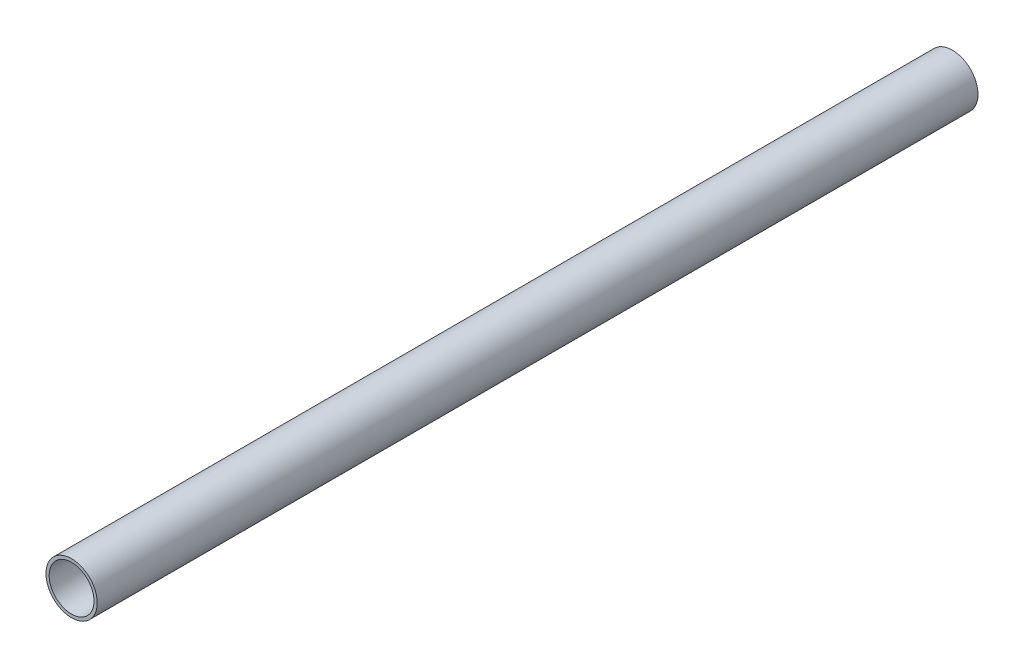
ISO-10303-21;
HEADER;
FILE_DESCRIPTION(('STEP AP214'),'2;1');
FILE_NAME('part.step','',(''),(''),'','','');
FILE_SCHEMA(('AUTOMOTIVE_DESIGN { 1 0 10303 214 1 1 1 1 }'));
ENDSEC;
DATA;
#1=APPLICATION_CONTEXT('core data for automotive mechanical design processes');
#2=APPLICATION_PROTOCOL_DEFINITION('international standard','automotive_design',2000,#1);
#3=PRODUCT_CONTEXT('',#1,'mechanical');
#4=PRODUCT('Part','Part','',(#3));
#5=PRODUCT_RELATED_PRODUCT_CATEGORY('part','',(#4));
#6=PRODUCT_DEFINITION_FORMATION('','',#4);
#7=PRODUCT_DEFINITION_CONTEXT('part definition',#1,'design');
#8=PRODUCT_DEFINITION('design','',#6,#7);
#9=PRODUCT_DEFINITION_SHAPE('','',#8);
#10=(LENGTH_UNIT() NAMED_UNIT(*) SI_UNIT(.MILLI.,.METRE.));
#11=(NAMED_UNIT(*) PLANE_ANGLE_UNIT() SI_UNIT($,.RADIAN.));
#12=(NAMED_UNIT(*) SI_UNIT($,.STERADIAN.) SOLID_ANGLE_UNIT());
#13=UNCERTAINTY_MEASURE_WITH_UNIT(LENGTH_MEASURE(1.E-05),#10,'distance_accuracy_value','');
#14=(GEOMETRIC_REPRESENTATION_CONTEXT(3) GLOBAL_UNCERTAINTY_ASSIGNED_CONTEXT((#13)) GLOBAL_UNIT_ASSIGNED_CONTEXT((#10,
#11,#12)) REPRESENTATION_CONTEXT('',''));
#15=CARTESIAN_POINT('',(0.,0.,0.));
#16=DIRECTION('',(0.,0.,1.));
#17=DIRECTION('',(1.,0.,0.));
#18=AXIS2_PLACEMENT_3D('',#15,#16,#17);
#19=CARTESIAN_POINT('',(0.,0.,275.));
#20=DIRECTION('',(0.,0.,1.));
#21=DIRECTION('',(1.,0.,0.));
#22=AXIS2_PLACEMENT_3D('',#19,#20,#21);
#23=PLANE('',#22);
#24=CARTESIAN_POINT('',(0.,0.,275.));
#25=DIRECTION('',(0.,0.,1.));
#26=DIRECTION('',(1.,0.,0.));
#27=AXIS2_PLACEMENT_3D('',#24,#25,#26);
#28=CIRCLE('',#27,7.);
#29=CARTESIAN_POINT('',(7.,0.,275.));
#30=VERTEX_POINT('',#29);
#31=EDGE_CURVE('E48',#30,#30,#28,.T.);
#32=ORIENTED_EDGE('',*,*,#31,.F.);
#33=EDGE_LOOP('',(#32));
#34=FACE_BOUND('',#33,.T.);
#35=CARTESIAN_POINT('',(0.,0.,275.));
#36=DIRECTION('',(0.,0.,1.));
#37=DIRECTION('',(1.,0.,0.));
#38=AXIS2_PLACEMENT_3D('',#35,#36,#37);
#39=CIRCLE('',#38,8.);
#40=CARTESIAN_POINT('',(8.,0.,275.));
#41=VERTEX_POINT('',#40);
#42=EDGE_CURVE('E11',#41,#41,#39,.T.);
#43=ORIENTED_EDGE('',*,*,#42,.T.);
#44=EDGE_LOOP('',(#43));
#45=FACE_BOUND('',#44,.T.);
#46=ADVANCED_FACE('F34',(#34,#45),#23,.T.);
#47=CARTESIAN_POINT('',(0.,0.,0.));
#48=DIRECTION('',(0.,0.,1.));
#49=DIRECTION('',(1.,0.,0.));
#50=AXIS2_PLACEMENT_3D('',#47,#48,#49);
#51=PLANE('',#50);
#52=CARTESIAN_POINT('',(0.,0.,0.));
#53=DIRECTION('',(0.,0.,1.));
#54=DIRECTION('',(1.,0.,0.));
#55=AXIS2_PLACEMENT_3D('',#52,#53,#54);
#56=CIRCLE('',#55,7.);
#57=CARTESIAN_POINT('',(7.,0.,0.));
#58=VERTEX_POINT('',#57);
#59=EDGE_CURVE('E38',#58,#58,#56,.T.);
#60=ORIENTED_EDGE('',*,*,#59,.T.);
#61=EDGE_LOOP('',(#60));
#62=FACE_BOUND('',#61,.T.);
#63=CARTESIAN_POINT('',(0.,0.,0.));
#64=DIRECTION('',(0.,0.,1.));
#65=DIRECTION('',(1.,0.,0.));
#66=AXIS2_PLACEMENT_3D('',#63,#64,#65);
#67=CIRCLE('',#66,8.);
#68=CARTESIAN_POINT('',(8.,0.,0.));
#69=VERTEX_POINT('',#68);
#70=EDGE_CURVE('E42',#69,#69,#67,.T.);
#71=ORIENTED_EDGE('',*,*,#70,.F.);
#72=EDGE_LOOP('',(#71));
#73=FACE_BOUND('',#72,.T.);
#74=ADVANCED_FACE('F68',(#62,#73),#51,.F.);
#75=CARTESIAN_POINT('',(0.,0.,0.));
#76=DIRECTION('',(0.,0.,1.));
#77=DIRECTION('',(1.,0.,0.));
#78=AXIS2_PLACEMENT_3D('',#75,#76,#77);
#79=CYLINDRICAL_SURFACE('',#78,8.);
#80=ORIENTED_EDGE('',*,*,#42,.F.);
#81=EDGE_LOOP('',(#80));
#82=FACE_BOUND('',#81,.T.);
#83=ORIENTED_EDGE('',*,*,#70,.T.);
#84=EDGE_LOOP('',(#83));
#85=FACE_BOUND('',#84,.T.);
#86=ADVANCED_FACE('F77',(#82,#85),#79,.T.);
#87=CARTESIAN_POINT('',(0.,0.,-0.153817756774158));
#88=DIRECTION('',(0.,0.,1.));
#89=DIRECTION('',(1.,0.,0.));
#90=AXIS2_PLACEMENT_3D('',#87,#88,#89);
#91=CYLINDRICAL_SURFACE('',#90,7.);
#92=ORIENTED_EDGE('',*,*,#31,.T.);
#93=EDGE_LOOP('',(#92));
#94=FACE_BOUND('',#93,.T.);
#95=ORIENTED_EDGE('',*,*,#59,.F.);
#96=EDGE_LOOP('',(#95));
#97=FACE_BOUND('',#96,.T.);
#98=ADVANCED_FACE('F79',(#94,#97),#91,.F.);
#99=CLOSED_SHELL('',(#46,#74,#86,#98));
#100=MANIFOLD_SOLID_BREP('B2',#99);
#101=ADVANCED_BREP_SHAPE_REPRESENTATION('',(#18,#100),#14);
#102=SHAPE_DEFINITION_REPRESENTATION(#9,#101);
ENDSEC;
END-ISO-10303-21;
